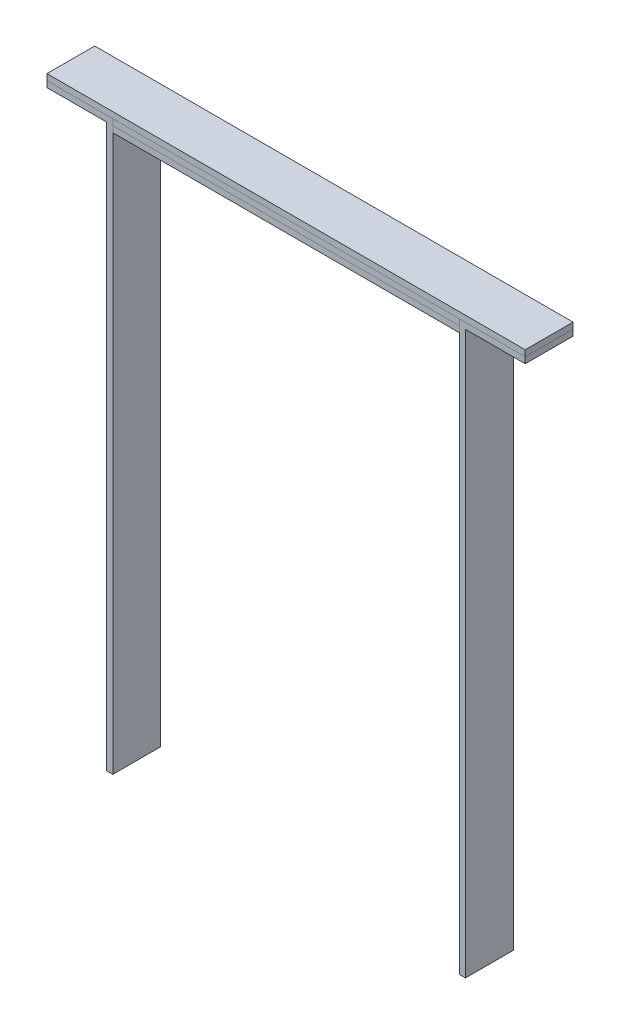
ISO-10303-21;
HEADER;
FILE_DESCRIPTION(('STEP AP214'),'2;1');
FILE_NAME('part.step','',(''),(''),'','','');
FILE_SCHEMA(('AUTOMOTIVE_DESIGN { 1 0 10303 214 1 1 1 1 }'));
ENDSEC;
DATA;
#1=APPLICATION_CONTEXT('core data for automotive mechanical design processes');
#2=APPLICATION_PROTOCOL_DEFINITION('international standard','automotive_design',2000,#1);
#3=PRODUCT_CONTEXT('',#1,'mechanical');
#4=PRODUCT('Part','Part','',(#3));
#5=PRODUCT_RELATED_PRODUCT_CATEGORY('part','',(#4));
#6=PRODUCT_DEFINITION_FORMATION('','',#4);
#7=PRODUCT_DEFINITION_CONTEXT('part definition',#1,'design');
#8=PRODUCT_DEFINITION('design','',#6,#7);
#9=PRODUCT_DEFINITION_SHAPE('','',#8);
#10=(LENGTH_UNIT() NAMED_UNIT(*) SI_UNIT(.MILLI.,.METRE.));
#11=(NAMED_UNIT(*) PLANE_ANGLE_UNIT() SI_UNIT($,.RADIAN.));
#12=(NAMED_UNIT(*) SI_UNIT($,.STERADIAN.) SOLID_ANGLE_UNIT());
#13=UNCERTAINTY_MEASURE_WITH_UNIT(LENGTH_MEASURE(1.E-05),#10,'distance_accuracy_value','');
#14=(GEOMETRIC_REPRESENTATION_CONTEXT(3) GLOBAL_UNCERTAINTY_ASSIGNED_CONTEXT((#13)) GLOBAL_UNIT_ASSIGNED_CONTEXT((#10,
#11,#12)) REPRESENTATION_CONTEXT('',''));
#15=CARTESIAN_POINT('',(0.,0.,0.));
#16=DIRECTION('',(0.,0.,1.));
#17=DIRECTION('',(1.,0.,0.));
#18=AXIS2_PLACEMENT_3D('',#15,#16,#17);
#19=CARTESIAN_POINT('',(1.27,0.,10.));
#20=DIRECTION('',(1.,0.,0.));
#21=DIRECTION('',(0.,1.,0.));
#22=AXIS2_PLACEMENT_3D('',#19,#20,#21);
#23=PLANE('',#22);
#24=DIRECTION('',(0.,-1.,0.));
#25=VECTOR('',#24,1.);
#26=CARTESIAN_POINT('',(1.27,0.,0.));
#27=LINE('',#26,#25);
#28=CARTESIAN_POINT('',(1.26999999999999,117.46,0.));
#29=VERTEX_POINT('',#28);
#30=CARTESIAN_POINT('',(1.26999999999999,116.19,0.));
#31=VERTEX_POINT('',#30);
#32=EDGE_CURVE('E115',#29,#31,#27,.T.);
#33=ORIENTED_EDGE('',*,*,#32,.T.);
#34=DIRECTION('',(0.,0.,-1.));
#35=VECTOR('',#34,1.);
#36=CARTESIAN_POINT('',(1.26999999999999,116.19,10.));
#37=LINE('',#36,#35);
#38=CARTESIAN_POINT('',(1.26999999999999,116.19,10.));
#39=VERTEX_POINT('',#38);
#40=EDGE_CURVE('E12',#39,#31,#37,.T.);
#41=ORIENTED_EDGE('',*,*,#40,.F.);
#42=DIRECTION('',(0.,-1.,0.));
#43=VECTOR('',#42,1.);
#44=CARTESIAN_POINT('',(1.27,0.,10.));
#45=LINE('',#44,#43);
#46=CARTESIAN_POINT('',(1.26999999999999,117.46,10.));
#47=VERTEX_POINT('',#46);
#48=EDGE_CURVE('E101',#47,#39,#45,.T.);
#49=ORIENTED_EDGE('',*,*,#48,.F.);
#50=DIRECTION('',(0.,0.,-1.));
#51=VECTOR('',#50,1.);
#52=CARTESIAN_POINT('',(1.26999999999999,117.46,10.));
#53=LINE('',#52,#51);
#54=EDGE_CURVE('E68',#47,#29,#53,.T.);
#55=ORIENTED_EDGE('',*,*,#54,.T.);
#56=EDGE_LOOP('',(#33,#41,#49,#55));
#57=FACE_BOUND('',#56,.T.);
#58=ADVANCED_FACE('F52',(#57),#23,.F.);
#59=CARTESIAN_POINT('',(0.,116.19,10.));
#60=DIRECTION('',(0.,1.,0.));
#61=DIRECTION('',(0.,0.,1.));
#62=AXIS2_PLACEMENT_3D('',#59,#60,#61);
#63=PLANE('',#62);
#64=DIRECTION('',(1.,0.,0.));
#65=VECTOR('',#64,1.);
#66=CARTESIAN_POINT('',(0.,116.19,0.));
#67=LINE('',#66,#65);
#68=CARTESIAN_POINT('',(73.73,116.19,0.));
#69=VERTEX_POINT('',#68);
#70=EDGE_CURVE('E106',#31,#69,#67,.T.);
#71=ORIENTED_EDGE('',*,*,#70,.T.);
#72=DIRECTION('',(0.,0.,-1.));
#73=VECTOR('',#72,1.);
#74=CARTESIAN_POINT('',(73.73,116.19,10.));
#75=LINE('',#74,#73);
#76=CARTESIAN_POINT('',(73.73,116.19,10.));
#77=VERTEX_POINT('',#76);
#78=EDGE_CURVE('E60',#77,#69,#75,.T.);
#79=ORIENTED_EDGE('',*,*,#78,.F.);
#80=DIRECTION('',(1.,0.,0.));
#81=VECTOR('',#80,1.);
#82=CARTESIAN_POINT('',(0.,116.19,10.));
#83=LINE('',#82,#81);
#84=EDGE_CURVE('E94',#39,#77,#83,.T.);
#85=ORIENTED_EDGE('',*,*,#84,.F.);
#86=ORIENTED_EDGE('',*,*,#40,.T.);
#87=EDGE_LOOP('',(#71,#79,#85,#86));
#88=FACE_BOUND('',#87,.T.);
#89=ADVANCED_FACE('F105',(#88),#63,.F.);
#90=CARTESIAN_POINT('',(73.73,0.,10.));
#91=DIRECTION('',(-1.,0.,0.));
#92=DIRECTION('',(0.,-1.,0.));
#93=AXIS2_PLACEMENT_3D('',#90,#91,#92);
#94=PLANE('',#93);
#95=DIRECTION('',(0.,1.,0.));
#96=VECTOR('',#95,1.);
#97=CARTESIAN_POINT('',(73.73,0.,0.));
#98=LINE('',#97,#96);
#99=CARTESIAN_POINT('',(73.73,117.46,0.));
#100=VERTEX_POINT('',#99);
#101=EDGE_CURVE('E118',#69,#100,#98,.T.);
#102=ORIENTED_EDGE('',*,*,#101,.T.);
#103=DIRECTION('',(0.,0.,-1.));
#104=VECTOR('',#103,1.);
#105=CARTESIAN_POINT('',(73.73,117.46,10.));
#106=LINE('',#105,#104);
#107=CARTESIAN_POINT('',(73.73,117.46,10.));
#108=VERTEX_POINT('',#107);
#109=EDGE_CURVE('E83',#108,#100,#106,.T.);
#110=ORIENTED_EDGE('',*,*,#109,.F.);
#111=DIRECTION('',(0.,1.,0.));
#112=VECTOR('',#111,1.);
#113=CARTESIAN_POINT('',(73.73,0.,10.));
#114=LINE('',#113,#112);
#115=EDGE_CURVE('E100',#77,#108,#114,.T.);
#116=ORIENTED_EDGE('',*,*,#115,.F.);
#117=ORIENTED_EDGE('',*,*,#78,.T.);
#118=EDGE_LOOP('',(#102,#110,#116,#117));
#119=FACE_BOUND('',#118,.T.);
#120=ADVANCED_FACE('F109',(#119),#94,.F.);
#121=CARTESIAN_POINT('',(0.,117.46,10.));
#122=DIRECTION('',(0.,1.,0.));
#123=DIRECTION('',(0.,0.,1.));
#124=AXIS2_PLACEMENT_3D('',#121,#122,#123);
#125=PLANE('',#124);
#126=DIRECTION('',(1.,0.,0.));
#127=VECTOR('',#126,1.);
#128=CARTESIAN_POINT('',(0.,117.46,0.));
#129=LINE('',#128,#127);
#130=EDGE_CURVE('E120',#29,#100,#129,.T.);
#131=ORIENTED_EDGE('',*,*,#130,.F.);
#132=ORIENTED_EDGE('',*,*,#54,.F.);
#133=DIRECTION('',(1.,0.,0.));
#134=VECTOR('',#133,1.);
#135=CARTESIAN_POINT('',(0.,117.46,10.));
#136=LINE('',#135,#134);
#137=EDGE_CURVE('E110',#47,#108,#136,.T.);
#138=ORIENTED_EDGE('',*,*,#137,.T.);
#139=ORIENTED_EDGE('',*,*,#109,.T.);
#140=EDGE_LOOP('',(#131,#132,#138,#139));
#141=FACE_BOUND('',#140,.T.);
#142=ADVANCED_FACE('F126',(#141),#125,.T.);
#143=CARTESIAN_POINT('',(0.,0.,10.));
#144=DIRECTION('',(0.,0.,1.));
#145=DIRECTION('',(1.,0.,0.));
#146=AXIS2_PLACEMENT_3D('',#143,#144,#145);
#147=PLANE('',#146);
#148=ORIENTED_EDGE('',*,*,#48,.T.);
#149=ORIENTED_EDGE('',*,*,#84,.T.);
#150=ORIENTED_EDGE('',*,*,#115,.T.);
#151=ORIENTED_EDGE('',*,*,#137,.F.);
#152=EDGE_LOOP('',(#148,#149,#150,#151));
#153=FACE_BOUND('',#152,.T.);
#154=ADVANCED_FACE('F97',(#153),#147,.T.);
#155=CARTESIAN_POINT('',(0.,0.,0.));
#156=DIRECTION('',(0.,0.,1.));
#157=DIRECTION('',(1.,0.,0.));
#158=AXIS2_PLACEMENT_3D('',#155,#156,#157);
#159=PLANE('',#158);
#160=ORIENTED_EDGE('',*,*,#32,.F.);
#161=ORIENTED_EDGE('',*,*,#130,.T.);
#162=ORIENTED_EDGE('',*,*,#101,.F.);
#163=ORIENTED_EDGE('',*,*,#70,.F.);
#164=EDGE_LOOP('',(#160,#161,#162,#163));
#165=FACE_BOUND('',#164,.T.);
#166=ADVANCED_FACE('F125',(#165),#159,.F.);
#167=CLOSED_SHELL('',(#58,#89,#120,#142,#154,#166));
#168=MANIFOLD_SOLID_BREP('B2',#167);
#169=CARTESIAN_POINT('',(0.,118.73,10.));
#170=DIRECTION('',(0.,-1.,0.));
#171=DIRECTION('',(0.,0.,-1.));
#172=AXIS2_PLACEMENT_3D('',#169,#170,#171);
#173=PLANE('',#172);
#174=DIRECTION('',(-1.,0.,0.));
#175=VECTOR('',#174,1.);
#176=CARTESIAN_POINT('',(0.,118.73,0.));
#177=LINE('',#176,#175);
#178=CARTESIAN_POINT('',(87.5,118.73,0.));
#179=VERTEX_POINT('',#178);
#180=CARTESIAN_POINT('',(-12.5,118.73,0.));
#181=VERTEX_POINT('',#180);
#182=EDGE_CURVE('E257',#179,#181,#177,.T.);
#183=ORIENTED_EDGE('',*,*,#182,.F.);
#184=DIRECTION('',(0.,0.,-1.));
#185=VECTOR('',#184,1.);
#186=CARTESIAN_POINT('',(87.5,118.73,10.));
#187=LINE('',#186,#185);
#188=CARTESIAN_POINT('',(87.5,118.73,10.));
#189=VERTEX_POINT('',#188);
#190=EDGE_CURVE('E50',#189,#179,#187,.T.);
#191=ORIENTED_EDGE('',*,*,#190,.F.);
#192=DIRECTION('',(-1.,0.,0.));
#193=VECTOR('',#192,1.);
#194=CARTESIAN_POINT('',(0.,118.73,10.));
#195=LINE('',#194,#193);
#196=CARTESIAN_POINT('',(-12.5,118.73,10.));
#197=VERTEX_POINT('',#196);
#198=EDGE_CURVE('E249',#189,#197,#195,.T.);
#199=ORIENTED_EDGE('',*,*,#198,.T.);
#200=DIRECTION('',(0.,0.,-1.));
#201=VECTOR('',#200,1.);
#202=CARTESIAN_POINT('',(-12.5,118.73,10.));
#203=LINE('',#202,#201);
#204=EDGE_CURVE('E210',#197,#181,#203,.T.);
#205=ORIENTED_EDGE('',*,*,#204,.T.);
#206=EDGE_LOOP('',(#183,#191,#199,#205));
#207=FACE_BOUND('',#206,.T.);
#208=ADVANCED_FACE('F194',(#207),#173,.T.);
#209=CARTESIAN_POINT('',(87.5,0.,10.));
#210=DIRECTION('',(1.,0.,0.));
#211=DIRECTION('',(0.,0.,-1.));
#212=AXIS2_PLACEMENT_3D('',#209,#210,#211);
#213=PLANE('',#212);
#214=DIRECTION('',(0.,-1.,0.));
#215=VECTOR('',#214,1.);
#216=CARTESIAN_POINT('',(87.5,0.,0.));
#217=LINE('',#216,#215);
#218=CARTESIAN_POINT('',(87.5,120.,0.));
#219=VERTEX_POINT('',#218);
#220=EDGE_CURVE('E240',#219,#179,#217,.T.);
#221=ORIENTED_EDGE('',*,*,#220,.F.);
#222=DIRECTION('',(0.,0.,-1.));
#223=VECTOR('',#222,1.);
#224=CARTESIAN_POINT('',(87.5,120.,10.));
#225=LINE('',#224,#223);
#226=CARTESIAN_POINT('',(87.5,120.,10.));
#227=VERTEX_POINT('',#226);
#228=EDGE_CURVE('E202',#227,#219,#225,.T.);
#229=ORIENTED_EDGE('',*,*,#228,.F.);
#230=DIRECTION('',(0.,-1.,0.));
#231=VECTOR('',#230,1.);
#232=CARTESIAN_POINT('',(87.5,0.,10.));
#233=LINE('',#232,#231);
#234=EDGE_CURVE('E238',#227,#189,#233,.T.);
#235=ORIENTED_EDGE('',*,*,#234,.T.);
#236=ORIENTED_EDGE('',*,*,#190,.T.);
#237=EDGE_LOOP('',(#221,#229,#235,#236));
#238=FACE_BOUND('',#237,.T.);
#239=ADVANCED_FACE('F237',(#238),#213,.T.);
#240=CARTESIAN_POINT('',(0.,120.,10.));
#241=DIRECTION('',(0.,1.,0.));
#242=DIRECTION('',(0.,0.,1.));
#243=AXIS2_PLACEMENT_3D('',#240,#241,#242);
#244=PLANE('',#243);
#245=DIRECTION('',(1.,0.,0.));
#246=VECTOR('',#245,1.);
#247=CARTESIAN_POINT('',(0.,120.,0.));
#248=LINE('',#247,#246);
#249=CARTESIAN_POINT('',(-12.5,120.,0.));
#250=VERTEX_POINT('',#249);
#251=EDGE_CURVE('E260',#250,#219,#248,.T.);
#252=ORIENTED_EDGE('',*,*,#251,.F.);
#253=DIRECTION('',(0.,0.,-1.));
#254=VECTOR('',#253,1.);
#255=CARTESIAN_POINT('',(-12.5,120.,10.));
#256=LINE('',#255,#254);
#257=CARTESIAN_POINT('',(-12.5,120.,10.));
#258=VERTEX_POINT('',#257);
#259=EDGE_CURVE('E223',#258,#250,#256,.T.);
#260=ORIENTED_EDGE('',*,*,#259,.F.);
#261=DIRECTION('',(1.,0.,0.));
#262=VECTOR('',#261,1.);
#263=CARTESIAN_POINT('',(0.,120.,10.));
#264=LINE('',#263,#262);
#265=EDGE_CURVE('E248',#258,#227,#264,.T.);
#266=ORIENTED_EDGE('',*,*,#265,.T.);
#267=ORIENTED_EDGE('',*,*,#228,.T.);
#268=EDGE_LOOP('',(#252,#260,#266,#267));
#269=FACE_BOUND('',#268,.T.);
#270=ADVANCED_FACE('F251',(#269),#244,.T.);
#271=CARTESIAN_POINT('',(-12.5,0.,10.));
#272=DIRECTION('',(-1.,0.,0.));
#273=DIRECTION('',(0.,0.,1.));
#274=AXIS2_PLACEMENT_3D('',#271,#272,#273);
#275=PLANE('',#274);
#276=DIRECTION('',(0.,1.,0.));
#277=VECTOR('',#276,1.);
#278=CARTESIAN_POINT('',(-12.5,0.,0.));
#279=LINE('',#278,#277);
#280=EDGE_CURVE('E262',#181,#250,#279,.T.);
#281=ORIENTED_EDGE('',*,*,#280,.F.);
#282=ORIENTED_EDGE('',*,*,#204,.F.);
#283=DIRECTION('',(0.,1.,0.));
#284=VECTOR('',#283,1.);
#285=CARTESIAN_POINT('',(-12.5,0.,10.));
#286=LINE('',#285,#284);
#287=EDGE_CURVE('E252',#197,#258,#286,.T.);
#288=ORIENTED_EDGE('',*,*,#287,.T.);
#289=ORIENTED_EDGE('',*,*,#259,.T.);
#290=EDGE_LOOP('',(#281,#282,#288,#289));
#291=FACE_BOUND('',#290,.T.);
#292=ADVANCED_FACE('F267',(#291),#275,.T.);
#293=CARTESIAN_POINT('',(0.,0.,10.));
#294=DIRECTION('',(0.,0.,1.));
#295=DIRECTION('',(1.,0.,0.));
#296=AXIS2_PLACEMENT_3D('',#293,#294,#295);
#297=PLANE('',#296);
#298=ORIENTED_EDGE('',*,*,#198,.F.);
#299=ORIENTED_EDGE('',*,*,#234,.F.);
#300=ORIENTED_EDGE('',*,*,#265,.F.);
#301=ORIENTED_EDGE('',*,*,#287,.F.);
#302=EDGE_LOOP('',(#298,#299,#300,#301));
#303=FACE_BOUND('',#302,.T.);
#304=ADVANCED_FACE('F246',(#303),#297,.T.);
#305=CARTESIAN_POINT('',(0.,0.,0.));
#306=DIRECTION('',(0.,0.,1.));
#307=DIRECTION('',(1.,0.,0.));
#308=AXIS2_PLACEMENT_3D('',#305,#306,#307);
#309=PLANE('',#308);
#310=ORIENTED_EDGE('',*,*,#182,.T.);
#311=ORIENTED_EDGE('',*,*,#280,.T.);
#312=ORIENTED_EDGE('',*,*,#251,.T.);
#313=ORIENTED_EDGE('',*,*,#220,.T.);
#314=EDGE_LOOP('',(#310,#311,#312,#313));
#315=FACE_BOUND('',#314,.T.);
#316=ADVANCED_FACE('F274',(#315),#309,.F.);
#317=CLOSED_SHELL('',(#208,#239,#270,#292,#304,#316));
#318=MANIFOLD_SOLID_BREP('B6',#317);
#319=CARTESIAN_POINT('',(1.27,0.,10.));
#320=DIRECTION('',(1.,0.,0.));
#321=DIRECTION('',(0.,1.,0.));
#322=AXIS2_PLACEMENT_3D('',#319,#320,#321);
#323=PLANE('',#322);
#324=DIRECTION('',(0.,-1.,0.));
#325=VECTOR('',#324,1.);
#326=CARTESIAN_POINT('',(1.27,0.,0.));
#327=LINE('',#326,#325);
#328=CARTESIAN_POINT('',(1.26999999999999,118.73,0.));
#329=VERTEX_POINT('',#328);
#330=CARTESIAN_POINT('',(1.26999999999999,117.46,0.));
#331=VERTEX_POINT('',#330);
#332=EDGE_CURVE('E399',#329,#331,#327,.T.);
#333=ORIENTED_EDGE('',*,*,#332,.T.);
#334=DIRECTION('',(0.,0.,-1.));
#335=VECTOR('',#334,1.);
#336=CARTESIAN_POINT('',(1.26999999999999,117.46,10.));
#337=LINE('',#336,#335);
#338=CARTESIAN_POINT('',(1.26999999999999,117.46,10.));
#339=VERTEX_POINT('',#338);
#340=EDGE_CURVE('E192',#339,#331,#337,.T.);
#341=ORIENTED_EDGE('',*,*,#340,.F.);
#342=DIRECTION('',(0.,-1.,0.));
#343=VECTOR('',#342,1.);
#344=CARTESIAN_POINT('',(1.27,0.,10.));
#345=LINE('',#344,#343);
#346=CARTESIAN_POINT('',(1.26999999999999,118.73,10.));
#347=VERTEX_POINT('',#346);
#348=EDGE_CURVE('E387',#347,#339,#345,.T.);
#349=ORIENTED_EDGE('',*,*,#348,.F.);
#350=DIRECTION('',(0.,0.,-1.));
#351=VECTOR('',#350,1.);
#352=CARTESIAN_POINT('',(1.26999999999999,118.73,10.));
#353=LINE('',#352,#351);
#354=EDGE_CURVE('E395',#347,#329,#353,.T.);
#355=ORIENTED_EDGE('',*,*,#354,.T.);
#356=EDGE_LOOP('',(#333,#341,#349,#355));
#357=FACE_BOUND('',#356,.T.);
#358=ADVANCED_FACE('F336',(#357),#323,.F.);
#359=CARTESIAN_POINT('',(0.,117.46,10.));
#360=DIRECTION('',(0.,1.,0.));
#361=DIRECTION('',(0.,0.,1.));
#362=AXIS2_PLACEMENT_3D('',#359,#360,#361);
#363=PLANE('',#362);
#364=DIRECTION('',(1.,0.,0.));
#365=VECTOR('',#364,1.);
#366=CARTESIAN_POINT('',(0.,117.46,0.));
#367=LINE('',#366,#365);
#368=CARTESIAN_POINT('',(73.73,117.46,0.));
#369=VERTEX_POINT('',#368);
#370=EDGE_CURVE('E391',#331,#369,#367,.T.);
#371=ORIENTED_EDGE('',*,*,#370,.T.);
#372=DIRECTION('',(0.,0.,-1.));
#373=VECTOR('',#372,1.);
#374=CARTESIAN_POINT('',(73.73,117.46,10.));
#375=LINE('',#374,#373);
#376=CARTESIAN_POINT('',(73.73,117.46,10.));
#377=VERTEX_POINT('',#376);
#378=EDGE_CURVE('E344',#377,#369,#375,.T.);
#379=ORIENTED_EDGE('',*,*,#378,.F.);
#380=DIRECTION('',(1.,0.,0.));
#381=VECTOR('',#380,1.);
#382=CARTESIAN_POINT('',(0.,117.46,10.));
#383=LINE('',#382,#381);
#384=EDGE_CURVE('E382',#339,#377,#383,.T.);
#385=ORIENTED_EDGE('',*,*,#384,.F.);
#386=ORIENTED_EDGE('',*,*,#340,.T.);
#387=EDGE_LOOP('',(#371,#379,#385,#386));
#388=FACE_BOUND('',#387,.T.);
#389=ADVANCED_FACE('F390',(#388),#363,.F.);
#390=CARTESIAN_POINT('',(73.73,0.,10.));
#391=DIRECTION('',(-1.,0.,0.));
#392=DIRECTION('',(0.,-1.,0.));
#393=AXIS2_PLACEMENT_3D('',#390,#391,#392);
#394=PLANE('',#393);
#395=DIRECTION('',(0.,1.,0.));
#396=VECTOR('',#395,1.);
#397=CARTESIAN_POINT('',(73.73,0.,0.));
#398=LINE('',#397,#396);
#399=CARTESIAN_POINT('',(73.73,118.73,0.));
#400=VERTEX_POINT('',#399);
#401=EDGE_CURVE('E369',#369,#400,#398,.T.);
#402=ORIENTED_EDGE('',*,*,#401,.T.);
#403=DIRECTION('',(0.,0.,-1.));
#404=VECTOR('',#403,1.);
#405=CARTESIAN_POINT('',(73.73,118.73,10.));
#406=LINE('',#405,#404);
#407=CARTESIAN_POINT('',(73.73,118.73,10.));
#408=VERTEX_POINT('',#407);
#409=EDGE_CURVE('E392',#408,#400,#406,.T.);
#410=ORIENTED_EDGE('',*,*,#409,.F.);
#411=DIRECTION('',(0.,1.,0.));
#412=VECTOR('',#411,1.);
#413=CARTESIAN_POINT('',(73.73,0.,10.));
#414=LINE('',#413,#412);
#415=EDGE_CURVE('E385',#377,#408,#414,.T.);
#416=ORIENTED_EDGE('',*,*,#415,.F.);
#417=ORIENTED_EDGE('',*,*,#378,.T.);
#418=EDGE_LOOP('',(#402,#410,#416,#417));
#419=FACE_BOUND('',#418,.T.);
#420=ADVANCED_FACE('F393',(#419),#394,.F.);
#421=CARTESIAN_POINT('',(0.,118.73,10.));
#422=DIRECTION('',(0.,-1.,0.));
#423=DIRECTION('',(0.,0.,-1.));
#424=AXIS2_PLACEMENT_3D('',#421,#422,#423);
#425=PLANE('',#424);
#426=DIRECTION('',(-1.,0.,0.));
#427=VECTOR('',#426,1.);
#428=CARTESIAN_POINT('',(0.,118.73,0.));
#429=LINE('',#428,#427);
#430=EDGE_CURVE('E375',#400,#329,#429,.T.);
#431=ORIENTED_EDGE('',*,*,#430,.T.);
#432=ORIENTED_EDGE('',*,*,#354,.F.);
#433=DIRECTION('',(-1.,0.,0.));
#434=VECTOR('',#433,1.);
#435=CARTESIAN_POINT('',(0.,118.73,10.));
#436=LINE('',#435,#434);
#437=EDGE_CURVE('E352',#408,#347,#436,.T.);
#438=ORIENTED_EDGE('',*,*,#437,.F.);
#439=ORIENTED_EDGE('',*,*,#409,.T.);
#440=EDGE_LOOP('',(#431,#432,#438,#439));
#441=FACE_BOUND('',#440,.T.);
#442=ADVANCED_FACE('F406',(#441),#425,.F.);
#443=CARTESIAN_POINT('',(0.,0.,10.));
#444=DIRECTION('',(0.,0.,1.));
#445=DIRECTION('',(1.,0.,0.));
#446=AXIS2_PLACEMENT_3D('',#443,#444,#445);
#447=PLANE('',#446);
#448=ORIENTED_EDGE('',*,*,#348,.T.);
#449=ORIENTED_EDGE('',*,*,#384,.T.);
#450=ORIENTED_EDGE('',*,*,#415,.T.);
#451=ORIENTED_EDGE('',*,*,#437,.T.);
#452=EDGE_LOOP('',(#448,#449,#450,#451));
#453=FACE_BOUND('',#452,.T.);
#454=ADVANCED_FACE('F383',(#453),#447,.T.);
#455=CARTESIAN_POINT('',(0.,0.,0.));
#456=DIRECTION('',(0.,0.,1.));
#457=DIRECTION('',(1.,0.,0.));
#458=AXIS2_PLACEMENT_3D('',#455,#456,#457);
#459=PLANE('',#458);
#460=ORIENTED_EDGE('',*,*,#332,.F.);
#461=ORIENTED_EDGE('',*,*,#430,.F.);
#462=ORIENTED_EDGE('',*,*,#401,.F.);
#463=ORIENTED_EDGE('',*,*,#370,.F.);
#464=EDGE_LOOP('',(#460,#461,#462,#463));
#465=FACE_BOUND('',#464,.T.);
#466=ADVANCED_FACE('F409',(#465),#459,.F.);
#467=CLOSED_SHELL('',(#358,#389,#420,#442,#454,#466));
#468=MANIFOLD_SOLID_BREP('B44',#467);
#469=CARTESIAN_POINT('',(73.73,0.,10.));
#470=DIRECTION('',(-1.,0.,0.));
#471=DIRECTION('',(0.,-1.,0.));
#472=AXIS2_PLACEMENT_3D('',#469,#470,#471);
#473=PLANE('',#472);
#474=DIRECTION('',(0.,1.,0.));
#475=VECTOR('',#474,1.);
#476=CARTESIAN_POINT('',(73.73,0.,0.));
#477=LINE('',#476,#475);
#478=CARTESIAN_POINT('',(73.73,0.,0.));
#479=VERTEX_POINT('',#478);
#480=CARTESIAN_POINT('',(73.73,118.73,0.));
#481=VERTEX_POINT('',#480);
#482=EDGE_CURVE('E561',#479,#481,#477,.T.);
#483=ORIENTED_EDGE('',*,*,#482,.F.);
#484=DIRECTION('',(0.,0.,-1.));
#485=VECTOR('',#484,1.);
#486=CARTESIAN_POINT('',(73.73,0.,10.));
#487=LINE('',#486,#485);
#488=CARTESIAN_POINT('',(73.73,0.,10.));
#489=VERTEX_POINT('',#488);
#490=EDGE_CURVE('E334',#489,#479,#487,.T.);
#491=ORIENTED_EDGE('',*,*,#490,.F.);
#492=DIRECTION('',(0.,1.,0.));
#493=VECTOR('',#492,1.);
#494=CARTESIAN_POINT('',(73.73,0.,10.));
#495=LINE('',#494,#493);
#496=CARTESIAN_POINT('',(73.73,118.73,10.));
#497=VERTEX_POINT('',#496);
#498=EDGE_CURVE('E575',#489,#497,#495,.T.);
#499=ORIENTED_EDGE('',*,*,#498,.T.);
#500=DIRECTION('',(0.,0.,-1.));
#501=VECTOR('',#500,1.);
#502=CARTESIAN_POINT('',(73.73,118.73,10.));
#503=LINE('',#502,#501);
#504=EDGE_CURVE('E524',#497,#481,#503,.T.);
#505=ORIENTED_EDGE('',*,*,#504,.T.);
#506=EDGE_LOOP('',(#483,#491,#499,#505));
#507=FACE_BOUND('',#506,.T.);
#508=ADVANCED_FACE('F480',(#507),#473,.T.);
#509=CARTESIAN_POINT('',(0.,-1.9080239131939E-13,10.));
#510=DIRECTION('',(0.,-1.,0.));
#511=DIRECTION('',(1.,0.,0.));
#512=AXIS2_PLACEMENT_3D('',#509,#510,#511);
#513=PLANE('',#512);
#514=DIRECTION('',(-1.,0.,0.));
#515=VECTOR('',#514,1.);
#516=CARTESIAN_POINT('',(0.,-1.9080239131939E-13,0.));
#517=LINE('',#516,#515);
#518=CARTESIAN_POINT('',(75.,0.,0.));
#519=VERTEX_POINT('',#518);
#520=EDGE_CURVE('E564',#519,#479,#517,.T.);
#521=ORIENTED_EDGE('',*,*,#520,.F.);
#522=DIRECTION('',(0.,0.,-1.));
#523=VECTOR('',#522,1.);
#524=CARTESIAN_POINT('',(75.,0.,10.));
#525=LINE('',#524,#523);
#526=CARTESIAN_POINT('',(75.,0.,10.));
#527=VERTEX_POINT('',#526);
#528=EDGE_CURVE('E488',#527,#519,#525,.T.);
#529=ORIENTED_EDGE('',*,*,#528,.F.);
#530=DIRECTION('',(-1.,0.,0.));
#531=VECTOR('',#530,1.);
#532=CARTESIAN_POINT('',(0.,-1.9080239131939E-13,10.));
#533=LINE('',#532,#531);
#534=EDGE_CURVE('E588',#527,#489,#533,.T.);
#535=ORIENTED_EDGE('',*,*,#534,.T.);
#536=ORIENTED_EDGE('',*,*,#490,.T.);
#537=EDGE_LOOP('',(#521,#529,#535,#536));
#538=FACE_BOUND('',#537,.T.);
#539=ADVANCED_FACE('F584',(#538),#513,.T.);
#540=CARTESIAN_POINT('',(75.,0.,10.));
#541=DIRECTION('',(1.,0.,0.));
#542=DIRECTION('',(0.,1.,0.));
#543=AXIS2_PLACEMENT_3D('',#540,#541,#542);
#544=PLANE('',#543);
#545=DIRECTION('',(0.,-1.,0.));
#546=VECTOR('',#545,1.);
#547=CARTESIAN_POINT('',(75.,0.,0.));
#548=LINE('',#547,#546);
#549=CARTESIAN_POINT('',(75.,117.46,0.));
#550=VERTEX_POINT('',#549);
#551=EDGE_CURVE('E567',#550,#519,#548,.T.);
#552=ORIENTED_EDGE('',*,*,#551,.F.);
#553=DIRECTION('',(0.,0.,-1.));
#554=VECTOR('',#553,1.);
#555=CARTESIAN_POINT('',(75.,117.46,10.));
#556=LINE('',#555,#554);
#557=CARTESIAN_POINT('',(75.,117.46,10.));
#558=VERTEX_POINT('',#557);
#559=EDGE_CURVE('E547',#558,#550,#556,.T.);
#560=ORIENTED_EDGE('',*,*,#559,.F.);
#561=DIRECTION('',(0.,-1.,0.));
#562=VECTOR('',#561,1.);
#563=CARTESIAN_POINT('',(75.,0.,10.));
#564=LINE('',#563,#562);
#565=EDGE_CURVE('E554',#558,#527,#564,.T.);
#566=ORIENTED_EDGE('',*,*,#565,.T.);
#567=ORIENTED_EDGE('',*,*,#528,.T.);
#568=EDGE_LOOP('',(#552,#560,#566,#567));
#569=FACE_BOUND('',#568,.T.);
#570=ADVANCED_FACE('F581',(#569),#544,.T.);
#571=CARTESIAN_POINT('',(0.,117.46,10.));
#572=DIRECTION('',(0.,-1.,0.));
#573=DIRECTION('',(0.,0.,-1.));
#574=AXIS2_PLACEMENT_3D('',#571,#572,#573);
#575=PLANE('',#574);
#576=DIRECTION('',(-1.,0.,0.));
#577=VECTOR('',#576,1.);
#578=CARTESIAN_POINT('',(0.,117.46,0.));
#579=LINE('',#578,#577);
#580=CARTESIAN_POINT('',(87.5,117.46,0.));
#581=VERTEX_POINT('',#580);
#582=EDGE_CURVE('E542',#581,#550,#579,.T.);
#583=ORIENTED_EDGE('',*,*,#582,.F.);
#584=DIRECTION('',(0.,0.,-1.));
#585=VECTOR('',#584,1.);
#586=CARTESIAN_POINT('',(87.5,117.46,10.));
#587=LINE('',#586,#585);
#588=CARTESIAN_POINT('',(87.5,117.46,10.));
#589=VERTEX_POINT('',#588);
#590=EDGE_CURVE('E537',#589,#581,#587,.T.);
#591=ORIENTED_EDGE('',*,*,#590,.F.);
#592=DIRECTION('',(-1.,0.,0.));
#593=VECTOR('',#592,1.);
#594=CARTESIAN_POINT('',(0.,117.46,10.));
#595=LINE('',#594,#593);
#596=EDGE_CURVE('E540',#589,#558,#595,.T.);
#597=ORIENTED_EDGE('',*,*,#596,.T.);
#598=ORIENTED_EDGE('',*,*,#559,.T.);
#599=EDGE_LOOP('',(#583,#591,#597,#598));
#600=FACE_BOUND('',#599,.T.);
#601=ADVANCED_FACE('F539',(#600),#575,.T.);
#602=CARTESIAN_POINT('',(87.5000000000013,9.56146797782511E-13,10.));
#603=DIRECTION('',(1.,0.,0.));
#604=DIRECTION('',(0.,1.,0.));
#605=AXIS2_PLACEMENT_3D('',#602,#603,#604);
#606=PLANE('',#605);
#607=DIRECTION('',(0.,-1.,0.));
#608=VECTOR('',#607,1.);
#609=CARTESIAN_POINT('',(87.5000000000013,9.56146797782511E-13,0.));
#610=LINE('',#609,#608);
#611=CARTESIAN_POINT('',(87.5,118.73,0.));
#612=VERTEX_POINT('',#611);
#613=EDGE_CURVE('E571',#612,#581,#610,.T.);
#614=ORIENTED_EDGE('',*,*,#613,.F.);
#615=DIRECTION('',(0.,0.,-1.));
#616=VECTOR('',#615,1.);
#617=CARTESIAN_POINT('',(87.5,118.73,10.));
#618=LINE('',#617,#616);
#619=CARTESIAN_POINT('',(87.5,118.73,10.));
#620=VERTEX_POINT('',#619);
#621=EDGE_CURVE('E517',#620,#612,#618,.T.);
#622=ORIENTED_EDGE('',*,*,#621,.F.);
#623=DIRECTION('',(0.,-1.,0.));
#624=VECTOR('',#623,1.);
#625=CARTESIAN_POINT('',(87.5000000000013,9.56146797782511E-13,10.));
#626=LINE('',#625,#624);
#627=EDGE_CURVE('E551',#620,#589,#626,.T.);
#628=ORIENTED_EDGE('',*,*,#627,.T.);
#629=ORIENTED_EDGE('',*,*,#590,.T.);
#630=EDGE_LOOP('',(#614,#622,#628,#629));
#631=FACE_BOUND('',#630,.T.);
#632=ADVANCED_FACE('F556',(#631),#606,.T.);
#633=CARTESIAN_POINT('',(0.,118.73,10.));
#634=DIRECTION('',(0.,-1.,0.));
#635=DIRECTION('',(0.,0.,-1.));
#636=AXIS2_PLACEMENT_3D('',#633,#634,#635);
#637=PLANE('',#636);
#638=DIRECTION('',(-1.,0.,0.));
#639=VECTOR('',#638,1.);
#640=CARTESIAN_POINT('',(0.,118.73,0.));
#641=LINE('',#640,#639);
#642=EDGE_CURVE('E573',#612,#481,#641,.T.);
#643=ORIENTED_EDGE('',*,*,#642,.T.);
#644=ORIENTED_EDGE('',*,*,#504,.F.);
#645=DIRECTION('',(-1.,0.,0.));
#646=VECTOR('',#645,1.);
#647=CARTESIAN_POINT('',(0.,118.73,10.));
#648=LINE('',#647,#646);
#649=EDGE_CURVE('E496',#620,#497,#648,.T.);
#650=ORIENTED_EDGE('',*,*,#649,.F.);
#651=ORIENTED_EDGE('',*,*,#621,.T.);
#652=EDGE_LOOP('',(#643,#644,#650,#651));
#653=FACE_BOUND('',#652,.T.);
#654=ADVANCED_FACE('F587',(#653),#637,.F.);
#655=CARTESIAN_POINT('',(0.,0.,10.));
#656=DIRECTION('',(0.,0.,1.));
#657=DIRECTION('',(1.,0.,0.));
#658=AXIS2_PLACEMENT_3D('',#655,#656,#657);
#659=PLANE('',#658);
#660=ORIENTED_EDGE('',*,*,#498,.F.);
#661=ORIENTED_EDGE('',*,*,#534,.F.);
#662=ORIENTED_EDGE('',*,*,#565,.F.);
#663=ORIENTED_EDGE('',*,*,#596,.F.);
#664=ORIENTED_EDGE('',*,*,#627,.F.);
#665=ORIENTED_EDGE('',*,*,#649,.T.);
#666=EDGE_LOOP('',(#660,#661,#662,#663,#664,#665));
#667=FACE_BOUND('',#666,.T.);
#668=ADVANCED_FACE('F550',(#667),#659,.T.);
#669=CARTESIAN_POINT('',(0.,0.,0.));
#670=DIRECTION('',(0.,0.,1.));
#671=DIRECTION('',(1.,0.,0.));
#672=AXIS2_PLACEMENT_3D('',#669,#670,#671);
#673=PLANE('',#672);
#674=ORIENTED_EDGE('',*,*,#482,.T.);
#675=ORIENTED_EDGE('',*,*,#642,.F.);
#676=ORIENTED_EDGE('',*,*,#613,.T.);
#677=ORIENTED_EDGE('',*,*,#582,.T.);
#678=ORIENTED_EDGE('',*,*,#551,.T.);
#679=ORIENTED_EDGE('',*,*,#520,.T.);
#680=EDGE_LOOP('',(#674,#675,#676,#677,#678,#679));
#681=FACE_BOUND('',#680,.T.);
#682=ADVANCED_FACE('F586',(#681),#673,.F.);
#683=CLOSED_SHELL('',(#508,#539,#570,#601,#632,#654,#668,#682));
#684=MANIFOLD_SOLID_BREP('B186',#683);
#685=CARTESIAN_POINT('',(0.,0.,10.));
#686=DIRECTION('',(0.,-1.,0.));
#687=DIRECTION('',(1.,0.,0.));
#688=AXIS2_PLACEMENT_3D('',#685,#686,#687);
#689=PLANE('',#688);
#690=DIRECTION('',(-1.,0.,0.));
#691=VECTOR('',#690,1.);
#692=CARTESIAN_POINT('',(0.,0.,0.));
#693=LINE('',#692,#691);
#694=CARTESIAN_POINT('',(1.27,0.,0.));
#695=VERTEX_POINT('',#694);
#696=CARTESIAN_POINT('',(0.,0.,0.));
#697=VERTEX_POINT('',#696);
#698=EDGE_CURVE('E745',#695,#697,#693,.T.);
#699=ORIENTED_EDGE('',*,*,#698,.F.);
#700=DIRECTION('',(0.,0.,-1.));
#701=VECTOR('',#700,1.);
#702=CARTESIAN_POINT('',(1.27,0.,10.));
#703=LINE('',#702,#701);
#704=CARTESIAN_POINT('',(1.27,0.,10.));
#705=VERTEX_POINT('',#704);
#706=EDGE_CURVE('E478',#705,#695,#703,.T.);
#707=ORIENTED_EDGE('',*,*,#706,.F.);
#708=DIRECTION('',(-1.,0.,0.));
#709=VECTOR('',#708,1.);
#710=CARTESIAN_POINT('',(0.,0.,10.));
#711=LINE('',#710,#709);
#712=CARTESIAN_POINT('',(0.,0.,10.));
#713=VERTEX_POINT('',#712);
#714=EDGE_CURVE('E759',#705,#713,#711,.T.);
#715=ORIENTED_EDGE('',*,*,#714,.T.);
#716=DIRECTION('',(0.,0.,-1.));
#717=VECTOR('',#716,1.);
#718=CARTESIAN_POINT('',(0.,0.,10.));
#719=LINE('',#718,#717);
#720=EDGE_CURVE('E680',#713,#697,#719,.T.);
#721=ORIENTED_EDGE('',*,*,#720,.T.);
#722=EDGE_LOOP('',(#699,#707,#715,#721));
#723=FACE_BOUND('',#722,.T.);
#724=ADVANCED_FACE('F664',(#723),#689,.T.);
#725=CARTESIAN_POINT('',(1.27,0.,10.));
#726=DIRECTION('',(1.,0.,0.));
#727=DIRECTION('',(0.,1.,0.));
#728=AXIS2_PLACEMENT_3D('',#725,#726,#727);
#729=PLANE('',#728);
#730=DIRECTION('',(0.,-1.,0.));
#731=VECTOR('',#730,1.);
#732=CARTESIAN_POINT('',(1.27,0.,0.));
#733=LINE('',#732,#731);
#734=CARTESIAN_POINT('',(1.26999999999999,118.73,0.));
#735=VERTEX_POINT('',#734);
#736=EDGE_CURVE('E747',#735,#695,#733,.T.);
#737=ORIENTED_EDGE('',*,*,#736,.F.);
#738=DIRECTION('',(0.,0.,-1.));
#739=VECTOR('',#738,1.);
#740=CARTESIAN_POINT('',(1.26999999999999,118.73,10.));
#741=LINE('',#740,#739);
#742=CARTESIAN_POINT('',(1.26999999999999,118.73,10.));
#743=VERTEX_POINT('',#742);
#744=EDGE_CURVE('E672',#743,#735,#741,.T.);
#745=ORIENTED_EDGE('',*,*,#744,.F.);
#746=DIRECTION('',(0.,-1.,0.));
#747=VECTOR('',#746,1.);
#748=CARTESIAN_POINT('',(1.27,0.,10.));
#749=LINE('',#748,#747);
#750=EDGE_CURVE('E843',#743,#705,#749,.T.);
#751=ORIENTED_EDGE('',*,*,#750,.T.);
#752=ORIENTED_EDGE('',*,*,#706,.T.);
#753=EDGE_LOOP('',(#737,#745,#751,#752));
#754=FACE_BOUND('',#753,.T.);
#755=ADVANCED_FACE('F768',(#754),#729,.T.);
#756=CARTESIAN_POINT('',(0.,118.73,10.));
#757=DIRECTION('',(0.,1.,0.));
#758=DIRECTION('',(0.,0.,1.));
#759=AXIS2_PLACEMENT_3D('',#756,#757,#758);
#760=PLANE('',#759);
#761=DIRECTION('',(1.,0.,0.));
#762=VECTOR('',#761,1.);
#763=CARTESIAN_POINT('',(0.,118.73,0.));
#764=LINE('',#763,#762);
#765=CARTESIAN_POINT('',(-12.5,118.73,0.));
#766=VERTEX_POINT('',#765);
#767=EDGE_CURVE('E750',#766,#735,#764,.T.);
#768=ORIENTED_EDGE('',*,*,#767,.F.);
#769=DIRECTION('',(0.,0.,-1.));
#770=VECTOR('',#769,1.);
#771=CARTESIAN_POINT('',(-12.5,118.73,10.));
#772=LINE('',#771,#770);
#773=CARTESIAN_POINT('',(-12.5,118.73,10.));
#774=VERTEX_POINT('',#773);
#775=EDGE_CURVE('E727',#774,#766,#772,.T.);
#776=ORIENTED_EDGE('',*,*,#775,.F.);
#777=DIRECTION('',(1.,0.,0.));
#778=VECTOR('',#777,1.);
#779=CARTESIAN_POINT('',(0.,118.73,10.));
#780=LINE('',#779,#778);
#781=EDGE_CURVE('E737',#774,#743,#780,.T.);
#782=ORIENTED_EDGE('',*,*,#781,.T.);
#783=ORIENTED_EDGE('',*,*,#744,.T.);
#784=EDGE_LOOP('',(#768,#776,#782,#783));
#785=FACE_BOUND('',#784,.T.);
#786=ADVANCED_FACE('F765',(#785),#760,.T.);
#787=CARTESIAN_POINT('',(-12.4999999999987,-1.365923996832E-13,10.));
#788=DIRECTION('',(-1.,0.,0.));
#789=DIRECTION('',(0.,-1.,0.));
#790=AXIS2_PLACEMENT_3D('',#787,#788,#789);
#791=PLANE('',#790);
#792=DIRECTION('',(0.,1.,0.));
#793=VECTOR('',#792,1.);
#794=CARTESIAN_POINT('',(-12.4999999999987,-1.365923996832E-13,0.));
#795=LINE('',#794,#793);
#796=CARTESIAN_POINT('',(-12.5,117.46,0.));
#797=VERTEX_POINT('',#796);
#798=EDGE_CURVE('E723',#797,#766,#795,.T.);
#799=ORIENTED_EDGE('',*,*,#798,.F.);
#800=DIRECTION('',(0.,0.,-1.));
#801=VECTOR('',#800,1.);
#802=CARTESIAN_POINT('',(-12.5,117.46,10.));
#803=LINE('',#802,#801);
#804=CARTESIAN_POINT('',(-12.5,117.46,10.));
#805=VERTEX_POINT('',#804);
#806=EDGE_CURVE('E718',#805,#797,#803,.T.);
#807=ORIENTED_EDGE('',*,*,#806,.F.);
#808=DIRECTION('',(0.,1.,0.));
#809=VECTOR('',#808,1.);
#810=CARTESIAN_POINT('',(-12.4999999999987,-1.365923996832E-13,10.));
#811=LINE('',#810,#809);
#812=EDGE_CURVE('E721',#805,#774,#811,.T.);
#813=ORIENTED_EDGE('',*,*,#812,.T.);
#814=ORIENTED_EDGE('',*,*,#775,.T.);
#815=EDGE_LOOP('',(#799,#807,#813,#814));
#816=FACE_BOUND('',#815,.T.);
#817=ADVANCED_FACE('F720',(#816),#791,.T.);
#818=CARTESIAN_POINT('',(1.30406796472471E-13,117.46,10.));
#819=DIRECTION('',(0.,-1.,0.));
#820=DIRECTION('',(1.,0.,0.));
#821=AXIS2_PLACEMENT_3D('',#818,#819,#820);
#822=PLANE('',#821);
#823=DIRECTION('',(-1.,0.,0.));
#824=VECTOR('',#823,1.);
#825=CARTESIAN_POINT('',(1.30406796472471E-13,117.46,0.));
#826=LINE('',#825,#824);
#827=CARTESIAN_POINT('',(0.,117.46,0.));
#828=VERTEX_POINT('',#827);
#829=EDGE_CURVE('E754',#828,#797,#826,.T.);
#830=ORIENTED_EDGE('',*,*,#829,.F.);
#831=DIRECTION('',(0.,0.,-1.));
#832=VECTOR('',#831,1.);
#833=CARTESIAN_POINT('',(0.,117.46,10.));
#834=LINE('',#833,#832);
#835=CARTESIAN_POINT('',(0.,117.46,10.));
#836=VERTEX_POINT('',#835);
#837=EDGE_CURVE('E699',#836,#828,#834,.T.);
#838=ORIENTED_EDGE('',*,*,#837,.F.);
#839=DIRECTION('',(-1.,0.,0.));
#840=VECTOR('',#839,1.);
#841=CARTESIAN_POINT('',(1.30406796472471E-13,117.46,10.));
#842=LINE('',#841,#840);
#843=EDGE_CURVE('E734',#836,#805,#842,.T.);
#844=ORIENTED_EDGE('',*,*,#843,.T.);
#845=ORIENTED_EDGE('',*,*,#806,.T.);
#846=EDGE_LOOP('',(#830,#838,#844,#845));
#847=FACE_BOUND('',#846,.T.);
#848=ADVANCED_FACE('F739',(#847),#822,.T.);
#849=CARTESIAN_POINT('',(0.,0.,10.));
#850=DIRECTION('',(-1.,0.,0.));
#851=DIRECTION('',(0.,0.,1.));
#852=AXIS2_PLACEMENT_3D('',#849,#850,#851);
#853=PLANE('',#852);
#854=DIRECTION('',(0.,1.,0.));
#855=VECTOR('',#854,1.);
#856=CARTESIAN_POINT('',(0.,0.,0.));
#857=LINE('',#856,#855);
#858=EDGE_CURVE('E756',#697,#828,#857,.T.);
#859=ORIENTED_EDGE('',*,*,#858,.F.);
#860=ORIENTED_EDGE('',*,*,#720,.F.);
#861=DIRECTION('',(0.,1.,0.));
#862=VECTOR('',#861,1.);
#863=CARTESIAN_POINT('',(0.,0.,10.));
#864=LINE('',#863,#862);
#865=EDGE_CURVE('E740',#713,#836,#864,.T.);
#866=ORIENTED_EDGE('',*,*,#865,.T.);
#867=ORIENTED_EDGE('',*,*,#837,.T.);
#868=EDGE_LOOP('',(#859,#860,#866,#867));
#869=FACE_BOUND('',#868,.T.);
#870=ADVANCED_FACE('F771',(#869),#853,.T.);
#871=CARTESIAN_POINT('',(0.,0.,10.));
#872=DIRECTION('',(0.,0.,1.));
#873=DIRECTION('',(1.,0.,0.));
#874=AXIS2_PLACEMENT_3D('',#871,#872,#873);
#875=PLANE('',#874);
#876=ORIENTED_EDGE('',*,*,#714,.F.);
#877=ORIENTED_EDGE('',*,*,#750,.F.);
#878=ORIENTED_EDGE('',*,*,#781,.F.);
#879=ORIENTED_EDGE('',*,*,#812,.F.);
#880=ORIENTED_EDGE('',*,*,#843,.F.);
#881=ORIENTED_EDGE('',*,*,#865,.F.);
#882=EDGE_LOOP('',(#876,#877,#878,#879,#880,#881));
#883=FACE_BOUND('',#882,.T.);
#884=ADVANCED_FACE('F732',(#883),#875,.T.);
#885=CARTESIAN_POINT('',(0.,0.,0.));
#886=DIRECTION('',(0.,0.,1.));
#887=DIRECTION('',(1.,0.,0.));
#888=AXIS2_PLACEMENT_3D('',#885,#886,#887);
#889=PLANE('',#888);
#890=ORIENTED_EDGE('',*,*,#698,.T.);
#891=ORIENTED_EDGE('',*,*,#858,.T.);
#892=ORIENTED_EDGE('',*,*,#829,.T.);
#893=ORIENTED_EDGE('',*,*,#798,.T.);
#894=ORIENTED_EDGE('',*,*,#767,.T.);
#895=ORIENTED_EDGE('',*,*,#736,.T.);
#896=EDGE_LOOP('',(#890,#891,#892,#893,#894,#895));
#897=FACE_BOUND('',#896,.T.);
#898=ADVANCED_FACE('F770',(#897),#889,.F.);
#899=CLOSED_SHELL('',(#724,#755,#786,#817,#848,#870,#884,#898));
#900=MANIFOLD_SOLID_BREP('B328',#899);
#901=ADVANCED_BREP_SHAPE_REPRESENTATION('',(#18,#168,#318,#468,#684,#900),#14);
#902=SHAPE_DEFINITION_REPRESENTATION(#9,#901);
ENDSEC;
END-ISO-10303-21;
